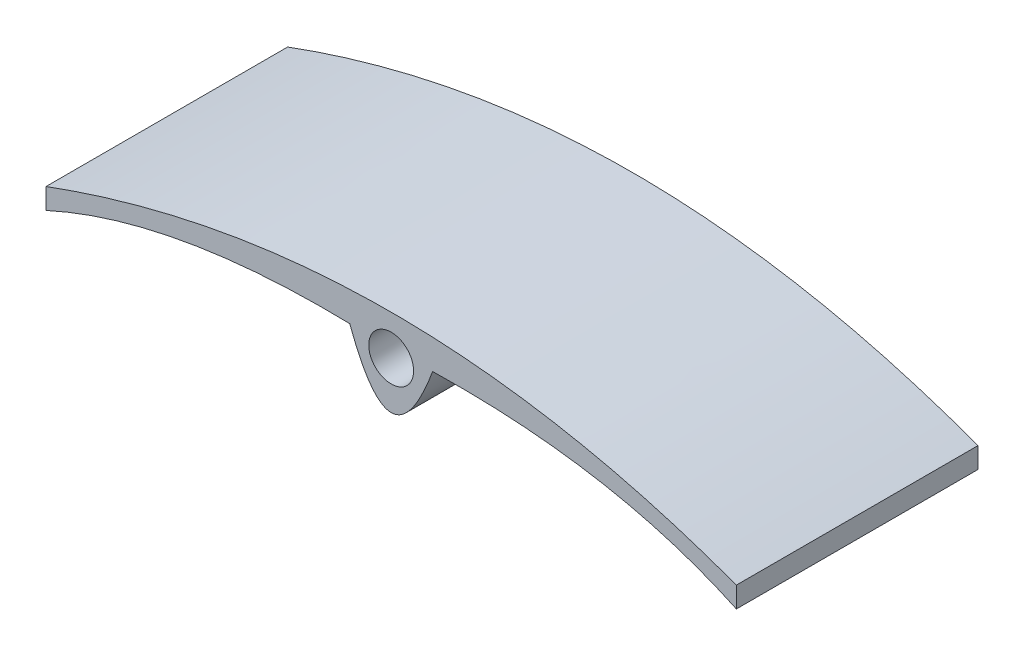
ISO-10303-21;
HEADER;
FILE_DESCRIPTION(('STEP AP214'),'2;1');
FILE_NAME('part.step','',(''),(''),'','','');
FILE_SCHEMA(('AUTOMOTIVE_DESIGN { 1 0 10303 214 1 1 1 1 }'));
ENDSEC;
DATA;
#1=APPLICATION_CONTEXT('core data for automotive mechanical design processes');
#2=APPLICATION_PROTOCOL_DEFINITION('international standard','automotive_design',2000,#1);
#3=PRODUCT_CONTEXT('',#1,'mechanical');
#4=PRODUCT('Part','Part','',(#3));
#5=PRODUCT_RELATED_PRODUCT_CATEGORY('part','',(#4));
#6=PRODUCT_DEFINITION_FORMATION('','',#4);
#7=PRODUCT_DEFINITION_CONTEXT('part definition',#1,'design');
#8=PRODUCT_DEFINITION('design','',#6,#7);
#9=PRODUCT_DEFINITION_SHAPE('','',#8);
#10=(LENGTH_UNIT() NAMED_UNIT(*) SI_UNIT(.MILLI.,.METRE.));
#11=(NAMED_UNIT(*) PLANE_ANGLE_UNIT() SI_UNIT($,.RADIAN.));
#12=(NAMED_UNIT(*) SI_UNIT($,.STERADIAN.) SOLID_ANGLE_UNIT());
#13=UNCERTAINTY_MEASURE_WITH_UNIT(LENGTH_MEASURE(1.E-05),#10,'distance_accuracy_value','');
#14=(GEOMETRIC_REPRESENTATION_CONTEXT(3) GLOBAL_UNCERTAINTY_ASSIGNED_CONTEXT((#13)) GLOBAL_UNIT_ASSIGNED_CONTEXT((#10,
#11,#12)) REPRESENTATION_CONTEXT('',''));
#15=CARTESIAN_POINT('',(0.,0.,0.));
#16=DIRECTION('',(0.,0.,1.));
#17=DIRECTION('',(1.,0.,0.));
#18=AXIS2_PLACEMENT_3D('',#15,#16,#17);
#19=CARTESIAN_POINT('',(0.,5.75967658803984,35.));
#20=DIRECTION('',(0.,0.,1.));
#21=DIRECTION('',(1.,0.,0.));
#22=AXIS2_PLACEMENT_3D('',#19,#20,#21);
#23=PLANE('',#22);
#24=CARTESIAN_POINT('',(50.,-3.48064682392032,35.));
#25=CARTESIAN_POINT('',(0.,15.,35.));
#26=CARTESIAN_POINT('',(-50.,-3.48064682392032,35.));
#27=B_SPLINE_CURVE_WITH_KNOTS('',2,(#24,#25,#26),.UNSPECIFIED.,.F.,.F.,(3,3),(0.,1.),.UNSPECIFIED.);
#28=CARTESIAN_POINT('',(50.,-3.48064682392032,35.));
#29=VERTEX_POINT('',#28);
#30=CARTESIAN_POINT('',(-50.,-3.48064682392032,35.));
#31=VERTEX_POINT('',#30);
#32=EDGE_CURVE('E160',#29,#31,#27,.T.);
#33=ORIENTED_EDGE('',*,*,#32,.T.);
#34=DIRECTION('',(0.,-1.,0.));
#35=VECTOR('',#34,1.);
#36=CARTESIAN_POINT('',(-50.,-3.48064682392032,35.));
#37=LINE('',#36,#35);
#38=CARTESIAN_POINT('',(-50.,-6.48064682392032,35.));
#39=VERTEX_POINT('',#38);
#40=EDGE_CURVE('E95',#31,#39,#37,.T.);
#41=ORIENTED_EDGE('',*,*,#40,.T.);
#42=CARTESIAN_POINT('',(-50.,-6.48064682392032,35.));
#43=CARTESIAN_POINT('',(-31.6079509094557,1.92055419695823,35.));
#44=CARTESIAN_POINT('',(-6.,1.31432306834996,35.));
#45=B_SPLINE_CURVE_WITH_KNOTS('',2,(#42,#43,#44),.UNSPECIFIED.,.F.,.F.,(3,3),(0.,1.),.UNSPECIFIED.);
#46=CARTESIAN_POINT('',(-6.,1.31432306834996,35.));
#47=VERTEX_POINT('',#46);
#48=EDGE_CURVE('E108',#39,#47,#45,.T.);
#49=ORIENTED_EDGE('',*,*,#48,.T.);
#50=CARTESIAN_POINT('',(-6.,1.31432306834996,35.));
#51=CARTESIAN_POINT('',(0.,-15.,35.));
#52=CARTESIAN_POINT('',(6.,1.31432306834996,35.));
#53=B_SPLINE_CURVE_WITH_KNOTS('',2,(#50,#51,#52),.UNSPECIFIED.,.F.,.F.,(3,3),(0.,1.),.UNSPECIFIED.);
#54=CARTESIAN_POINT('',(6.,1.31432306834996,35.));
#55=VERTEX_POINT('',#54);
#56=EDGE_CURVE('E102',#47,#55,#53,.T.);
#57=ORIENTED_EDGE('',*,*,#56,.T.);
#58=CARTESIAN_POINT('',(6.,1.31432306834996,35.));
#59=CARTESIAN_POINT('',(32.2286710129802,1.92055419695823,35.));
#60=CARTESIAN_POINT('',(50.,-6.48064682392032,35.));
#61=B_SPLINE_CURVE_WITH_KNOTS('',2,(#58,#59,#60),.UNSPECIFIED.,.F.,.F.,(3,3),(0.,1.),.UNSPECIFIED.);
#62=CARTESIAN_POINT('',(50.,-6.48064682392032,35.));
#63=VERTEX_POINT('',#62);
#64=EDGE_CURVE('E106',#55,#63,#61,.T.);
#65=ORIENTED_EDGE('',*,*,#64,.T.);
#66=DIRECTION('',(0.,1.,0.));
#67=VECTOR('',#66,1.);
#68=CARTESIAN_POINT('',(50.,-3.48064682392032,35.));
#69=LINE('',#68,#67);
#70=EDGE_CURVE('E58',#63,#29,#69,.T.);
#71=ORIENTED_EDGE('',*,*,#70,.T.);
#72=EDGE_LOOP('',(#33,#41,#49,#57,#65,#71));
#73=FACE_BOUND('',#72,.T.);
#74=CARTESIAN_POINT('',(0.,0.,35.));
#75=DIRECTION('',(0.,0.,1.));
#76=DIRECTION('',(1.,0.,0.));
#77=AXIS2_PLACEMENT_3D('',#74,#75,#76);
#78=CIRCLE('',#77,3.25);
#79=CARTESIAN_POINT('',(3.25,0.,35.));
#80=VERTEX_POINT('',#79);
#81=EDGE_CURVE('E173',#80,#80,#78,.T.);
#82=ORIENTED_EDGE('',*,*,#81,.F.);
#83=EDGE_LOOP('',(#82));
#84=FACE_BOUND('',#83,.T.);
#85=ADVANCED_FACE('F39',(#73,#84),#23,.T.);
#86=CARTESIAN_POINT('',(0.,5.75967658803984,0.));
#87=DIRECTION('',(0.,0.,1.));
#88=DIRECTION('',(1.,0.,0.));
#89=AXIS2_PLACEMENT_3D('',#86,#87,#88);
#90=PLANE('',#89);
#91=CARTESIAN_POINT('',(50.,-3.48064682392032,0.));
#92=CARTESIAN_POINT('',(0.,15.,0.));
#93=CARTESIAN_POINT('',(-50.,-3.48064682392032,0.));
#94=B_SPLINE_CURVE_WITH_KNOTS('',2,(#91,#92,#93),.UNSPECIFIED.,.F.,.F.,(3,3),(0.,1.),.UNSPECIFIED.);
#95=CARTESIAN_POINT('',(50.,-3.48064682392032,0.));
#96=VERTEX_POINT('',#95);
#97=CARTESIAN_POINT('',(-50.,-3.48064682392032,0.));
#98=VERTEX_POINT('',#97);
#99=EDGE_CURVE('E176',#96,#98,#94,.T.);
#100=ORIENTED_EDGE('',*,*,#99,.F.);
#101=DIRECTION('',(0.,1.,0.));
#102=VECTOR('',#101,1.);
#103=CARTESIAN_POINT('',(50.,-3.48064682392032,0.));
#104=LINE('',#103,#102);
#105=CARTESIAN_POINT('',(50.,-6.48064682392032,0.));
#106=VERTEX_POINT('',#105);
#107=EDGE_CURVE('E87',#106,#96,#104,.T.);
#108=ORIENTED_EDGE('',*,*,#107,.F.);
#109=CARTESIAN_POINT('',(6.,1.31432306834996,0.));
#110=CARTESIAN_POINT('',(32.2286710129802,1.92055419695823,0.));
#111=CARTESIAN_POINT('',(50.,-6.48064682392032,0.));
#112=B_SPLINE_CURVE_WITH_KNOTS('',2,(#109,#110,#111),.UNSPECIFIED.,.F.,.F.,(3,3),(0.,1.),.UNSPECIFIED.);
#113=CARTESIAN_POINT('',(6.,1.31432306834996,0.));
#114=VERTEX_POINT('',#113);
#115=EDGE_CURVE('E81',#114,#106,#112,.T.);
#116=ORIENTED_EDGE('',*,*,#115,.F.);
#117=CARTESIAN_POINT('',(-6.,1.31432306834996,0.));
#118=CARTESIAN_POINT('',(0.,-15.,0.));
#119=CARTESIAN_POINT('',(6.,1.31432306834996,0.));
#120=B_SPLINE_CURVE_WITH_KNOTS('',2,(#117,#118,#119),.UNSPECIFIED.,.F.,.F.,(3,3),(0.,1.),.UNSPECIFIED.);
#121=CARTESIAN_POINT('',(-6.,1.31432306834996,0.));
#122=VERTEX_POINT('',#121);
#123=EDGE_CURVE('E117',#122,#114,#120,.T.);
#124=ORIENTED_EDGE('',*,*,#123,.F.);
#125=CARTESIAN_POINT('',(-50.,-6.48064682392032,0.));
#126=CARTESIAN_POINT('',(-31.6079509094557,1.92055419695823,0.));
#127=CARTESIAN_POINT('',(-6.,1.31432306834996,0.));
#128=B_SPLINE_CURVE_WITH_KNOTS('',2,(#125,#126,#127),.UNSPECIFIED.,.F.,.F.,(3,3),(0.,1.),.UNSPECIFIED.);
#129=CARTESIAN_POINT('',(-50.,-6.48064682392032,0.));
#130=VERTEX_POINT('',#129);
#131=EDGE_CURVE('E186',#130,#122,#128,.T.);
#132=ORIENTED_EDGE('',*,*,#131,.F.);
#133=DIRECTION('',(0.,-1.,0.));
#134=VECTOR('',#133,1.);
#135=CARTESIAN_POINT('',(-50.,-3.48064682392032,0.));
#136=LINE('',#135,#134);
#137=EDGE_CURVE('E181',#98,#130,#136,.T.);
#138=ORIENTED_EDGE('',*,*,#137,.F.);
#139=EDGE_LOOP('',(#100,#108,#116,#124,#132,#138));
#140=FACE_BOUND('',#139,.T.);
#141=CARTESIAN_POINT('',(0.,0.,0.));
#142=DIRECTION('',(0.,0.,1.));
#143=DIRECTION('',(1.,0.,0.));
#144=AXIS2_PLACEMENT_3D('',#141,#142,#143);
#145=CIRCLE('',#144,3.25);
#146=CARTESIAN_POINT('',(3.25,0.,0.));
#147=VERTEX_POINT('',#146);
#148=EDGE_CURVE('E166',#147,#147,#145,.T.);
#149=ORIENTED_EDGE('',*,*,#148,.T.);
#150=EDGE_LOOP('',(#149));
#151=FACE_BOUND('',#150,.T.);
#152=ADVANCED_FACE('F226',(#140,#151),#90,.F.);
#153=DIRECTION('',(0.,0.,-1.));
#154=VECTOR('',#153,1.);
#155=SURFACE_OF_LINEAR_EXTRUSION('',#27,#154);
#156=ORIENTED_EDGE('',*,*,#99,.T.);
#157=DIRECTION('',(0.,0.,-1.));
#158=VECTOR('',#157,1.);
#159=CARTESIAN_POINT('',(-50.,-3.48064682392032,35.));
#160=LINE('',#159,#158);
#161=EDGE_CURVE('E11',#31,#98,#160,.T.);
#162=ORIENTED_EDGE('',*,*,#161,.F.);
#163=ORIENTED_EDGE('',*,*,#32,.F.);
#164=DIRECTION('',(0.,0.,-1.));
#165=VECTOR('',#164,1.);
#166=CARTESIAN_POINT('',(50.,-3.48064682392032,35.));
#167=LINE('',#166,#165);
#168=EDGE_CURVE('E126',#29,#96,#167,.T.);
#169=ORIENTED_EDGE('',*,*,#168,.T.);
#170=EDGE_LOOP('',(#156,#162,#163,#169));
#171=FACE_BOUND('',#170,.T.);
#172=ADVANCED_FACE('F41',(#171),#155,.F.);
#173=CARTESIAN_POINT('',(-50.,-3.48064682392032,35.));
#174=DIRECTION('',(1.,0.,0.));
#175=DIRECTION('',(0.,0.,-1.));
#176=AXIS2_PLACEMENT_3D('',#173,#174,#175);
#177=PLANE('',#176);
#178=ORIENTED_EDGE('',*,*,#137,.T.);
#179=DIRECTION('',(0.,0.,-1.));
#180=VECTOR('',#179,1.);
#181=CARTESIAN_POINT('',(-50.,-6.48064682392032,35.));
#182=LINE('',#181,#180);
#183=EDGE_CURVE('E50',#39,#130,#182,.T.);
#184=ORIENTED_EDGE('',*,*,#183,.F.);
#185=ORIENTED_EDGE('',*,*,#40,.F.);
#186=ORIENTED_EDGE('',*,*,#161,.T.);
#187=EDGE_LOOP('',(#178,#184,#185,#186));
#188=FACE_BOUND('',#187,.T.);
#189=ADVANCED_FACE('F149',(#188),#177,.F.);
#190=DIRECTION('',(0.,0.,-1.));
#191=VECTOR('',#190,1.);
#192=SURFACE_OF_LINEAR_EXTRUSION('',#45,#191);
#193=ORIENTED_EDGE('',*,*,#131,.T.);
#194=DIRECTION('',(0.,0.,-1.));
#195=VECTOR('',#194,1.);
#196=CARTESIAN_POINT('',(-6.,1.31432306834996,35.));
#197=LINE('',#196,#195);
#198=EDGE_CURVE('E119',#47,#122,#197,.T.);
#199=ORIENTED_EDGE('',*,*,#198,.F.);
#200=ORIENTED_EDGE('',*,*,#48,.F.);
#201=ORIENTED_EDGE('',*,*,#183,.T.);
#202=EDGE_LOOP('',(#193,#199,#200,#201));
#203=FACE_BOUND('',#202,.T.);
#204=ADVANCED_FACE('F147',(#203),#192,.F.);
#205=DIRECTION('',(0.,0.,-1.));
#206=VECTOR('',#205,1.);
#207=SURFACE_OF_LINEAR_EXTRUSION('',#53,#206);
#208=ORIENTED_EDGE('',*,*,#123,.T.);
#209=DIRECTION('',(0.,0.,-1.));
#210=VECTOR('',#209,1.);
#211=CARTESIAN_POINT('',(6.,1.31432306834996,35.));
#212=LINE('',#211,#210);
#213=EDGE_CURVE('E114',#55,#114,#212,.T.);
#214=ORIENTED_EDGE('',*,*,#213,.F.);
#215=ORIENTED_EDGE('',*,*,#56,.F.);
#216=ORIENTED_EDGE('',*,*,#198,.T.);
#217=EDGE_LOOP('',(#208,#214,#215,#216));
#218=FACE_BOUND('',#217,.T.);
#219=ADVANCED_FACE('F115',(#218),#207,.F.);
#220=DIRECTION('',(0.,0.,-1.));
#221=VECTOR('',#220,1.);
#222=SURFACE_OF_LINEAR_EXTRUSION('',#61,#221);
#223=ORIENTED_EDGE('',*,*,#115,.T.);
#224=DIRECTION('',(0.,0.,-1.));
#225=VECTOR('',#224,1.);
#226=CARTESIAN_POINT('',(50.,-6.48064682392032,35.));
#227=LINE('',#226,#225);
#228=EDGE_CURVE('E120',#63,#106,#227,.T.);
#229=ORIENTED_EDGE('',*,*,#228,.F.);
#230=ORIENTED_EDGE('',*,*,#64,.F.);
#231=ORIENTED_EDGE('',*,*,#213,.T.);
#232=EDGE_LOOP('',(#223,#229,#230,#231));
#233=FACE_BOUND('',#232,.T.);
#234=ADVANCED_FACE('F122',(#233),#222,.F.);
#235=CARTESIAN_POINT('',(50.,-3.48064682392032,35.));
#236=DIRECTION('',(-1.,0.,0.));
#237=DIRECTION('',(0.,0.,1.));
#238=AXIS2_PLACEMENT_3D('',#235,#236,#237);
#239=PLANE('',#238);
#240=ORIENTED_EDGE('',*,*,#107,.T.);
#241=ORIENTED_EDGE('',*,*,#168,.F.);
#242=ORIENTED_EDGE('',*,*,#70,.F.);
#243=ORIENTED_EDGE('',*,*,#228,.T.);
#244=EDGE_LOOP('',(#240,#241,#242,#243));
#245=FACE_BOUND('',#244,.T.);
#246=ADVANCED_FACE('F143',(#245),#239,.F.);
#247=CARTESIAN_POINT('',(0.,0.,35.));
#248=DIRECTION('',(0.,0.,-1.));
#249=DIRECTION('',(-1.,0.,0.));
#250=AXIS2_PLACEMENT_3D('',#247,#248,#249);
#251=CYLINDRICAL_SURFACE('',#250,3.25);
#252=ORIENTED_EDGE('',*,*,#81,.T.);
#253=EDGE_LOOP('',(#252));
#254=FACE_BOUND('',#253,.T.);
#255=ORIENTED_EDGE('',*,*,#148,.F.);
#256=EDGE_LOOP('',(#255));
#257=FACE_BOUND('',#256,.T.);
#258=ADVANCED_FACE('F230',(#254,#257),#251,.F.);
#259=CLOSED_SHELL('',(#85,#152,#172,#189,#204,#219,#234,#246,#258));
#260=MANIFOLD_SOLID_BREP('B2',#259);
#261=ADVANCED_BREP_SHAPE_REPRESENTATION('',(#18,#260),#14);
#262=SHAPE_DEFINITION_REPRESENTATION(#9,#261);
ENDSEC;
END-ISO-10303-21;
